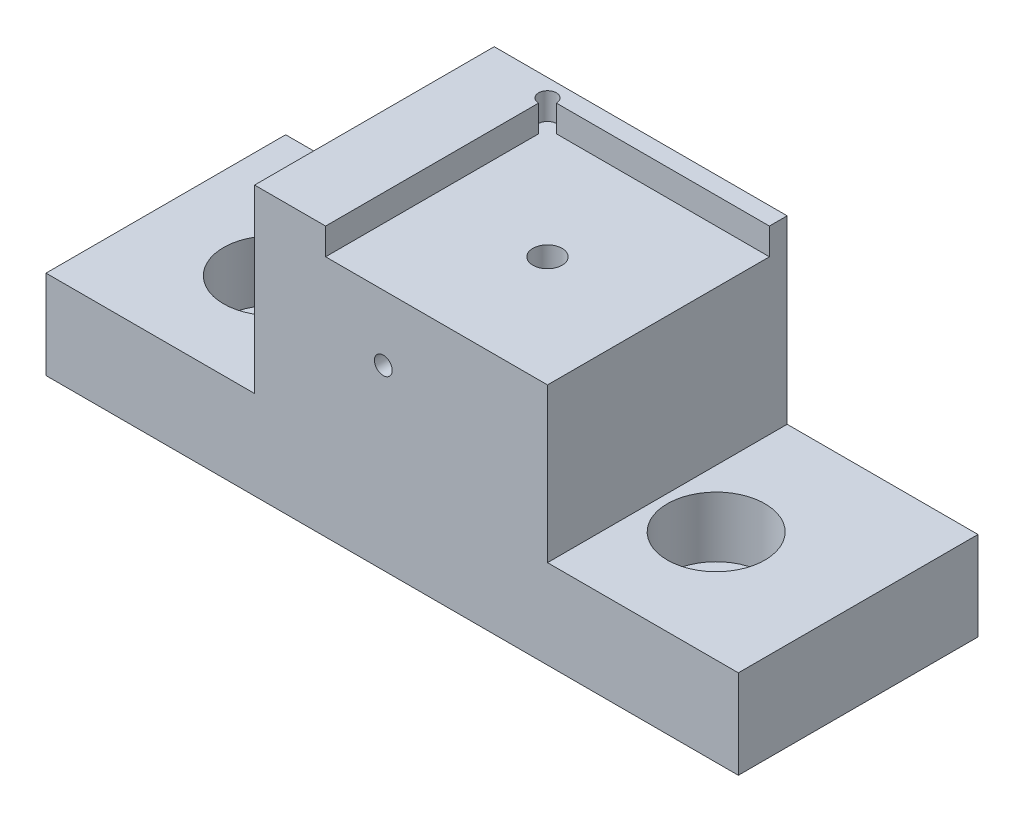
ISO-10303-21;
HEADER;
FILE_DESCRIPTION(('STEP AP214'),'2;1');
FILE_NAME('part.step','',(''),(''),'','','');
FILE_SCHEMA(('AUTOMOTIVE_DESIGN { 1 0 10303 214 1 1 1 1 }'));
ENDSEC;
DATA;
#1=APPLICATION_CONTEXT('core data for automotive mechanical design processes');
#2=APPLICATION_PROTOCOL_DEFINITION('international standard','automotive_design',2000,#1);
#3=PRODUCT_CONTEXT('',#1,'mechanical');
#4=PRODUCT('Part','Part','',(#3));
#5=PRODUCT_RELATED_PRODUCT_CATEGORY('part','',(#4));
#6=PRODUCT_DEFINITION_FORMATION('','',#4);
#7=PRODUCT_DEFINITION_CONTEXT('part definition',#1,'design');
#8=PRODUCT_DEFINITION('design','',#6,#7);
#9=PRODUCT_DEFINITION_SHAPE('','',#8);
#10=(LENGTH_UNIT() NAMED_UNIT(*) SI_UNIT(.MILLI.,.METRE.));
#11=(NAMED_UNIT(*) PLANE_ANGLE_UNIT() SI_UNIT($,.RADIAN.));
#12=(NAMED_UNIT(*) SI_UNIT($,.STERADIAN.) SOLID_ANGLE_UNIT());
#13=UNCERTAINTY_MEASURE_WITH_UNIT(LENGTH_MEASURE(1.E-05),#10,'distance_accuracy_value','');
#14=(GEOMETRIC_REPRESENTATION_CONTEXT(3) GLOBAL_UNCERTAINTY_ASSIGNED_CONTEXT((#13)) GLOBAL_UNIT_ASSIGNED_CONTEXT((#10,
#11,#12)) REPRESENTATION_CONTEXT('',''));
#15=CARTESIAN_POINT('',(0.,0.,0.));
#16=DIRECTION('',(0.,0.,1.));
#17=DIRECTION('',(1.,0.,0.));
#18=AXIS2_PLACEMENT_3D('',#15,#16,#17);
#19=CARTESIAN_POINT('',(-14.5,5.,-14.5));
#20=DIRECTION('',(0.,0.,1.));
#21=DIRECTION('',(1.,0.,0.));
#22=AXIS2_PLACEMENT_3D('',#19,#20,#21);
#23=PLANE('',#22);
#24=DIRECTION('',(0.,-1.,0.));
#25=VECTOR('',#24,1.);
#26=CARTESIAN_POINT('',(-44.,-15.3411677323979,-14.5));
#27=LINE('',#26,#25);
#28=CARTESIAN_POINT('',(-44.,-15.3411677323979,-14.5));
#29=VERTEX_POINT('',#28);
#30=CARTESIAN_POINT('',(-44.,-25.3411677323979,-14.5));
#31=VERTEX_POINT('',#30);
#32=EDGE_CURVE('E217',#29,#31,#27,.T.);
#33=ORIENTED_EDGE('',*,*,#32,.F.);
#34=DIRECTION('',(-1.,0.,0.));
#35=VECTOR('',#34,1.);
#36=CARTESIAN_POINT('',(34.,-15.3411677323979,-14.5));
#37=LINE('',#36,#35);
#38=CARTESIAN_POINT('',(-20.5,-15.3411677323979,-14.5));
#39=VERTEX_POINT('',#38);
#40=EDGE_CURVE('E224',#39,#29,#37,.T.);
#41=ORIENTED_EDGE('',*,*,#40,.F.);
#42=DIRECTION('',(0.,1.,0.));
#43=VECTOR('',#42,1.);
#44=CARTESIAN_POINT('',(-20.5,-70.794440441852,-14.5));
#45=LINE('',#44,#43);
#46=CARTESIAN_POINT('',(-20.5,5.,-14.5));
#47=VERTEX_POINT('',#46);
#48=EDGE_CURVE('E297',#39,#47,#45,.T.);
#49=ORIENTED_EDGE('',*,*,#48,.T.);
#50=DIRECTION('',(-1.,0.,0.));
#51=VECTOR('',#50,1.);
#52=CARTESIAN_POINT('',(-14.5,5.,-14.5));
#53=LINE('',#52,#51);
#54=CARTESIAN_POINT('',(12.5,5.,-14.5));
#55=VERTEX_POINT('',#54);
#56=EDGE_CURVE('E48',#55,#47,#53,.T.);
#57=ORIENTED_EDGE('',*,*,#56,.F.);
#58=DIRECTION('',(0.,1.,0.));
#59=VECTOR('',#58,1.);
#60=CARTESIAN_POINT('',(12.5,-25.3411677323979,-14.5));
#61=LINE('',#60,#59);
#62=CARTESIAN_POINT('',(12.5,-15.3411677323979,-14.5));
#63=VERTEX_POINT('',#62);
#64=EDGE_CURVE('E269',#63,#55,#61,.T.);
#65=ORIENTED_EDGE('',*,*,#64,.F.);
#66=CARTESIAN_POINT('',(34.,-15.3411677323979,-14.5));
#67=VERTEX_POINT('',#66);
#68=EDGE_CURVE('E229',#67,#63,#37,.T.);
#69=ORIENTED_EDGE('',*,*,#68,.F.);
#70=DIRECTION('',(0.,1.,0.));
#71=VECTOR('',#70,1.);
#72=CARTESIAN_POINT('',(34.,-15.3411677323979,-14.5));
#73=LINE('',#72,#71);
#74=CARTESIAN_POINT('',(34.,-25.3411677323979,-14.5));
#75=VERTEX_POINT('',#74);
#76=EDGE_CURVE('E225',#75,#67,#73,.T.);
#77=ORIENTED_EDGE('',*,*,#76,.F.);
#78=DIRECTION('',(1.,0.,0.));
#79=VECTOR('',#78,1.);
#80=CARTESIAN_POINT('',(14.5,-25.3411677323979,-14.5));
#81=LINE('',#80,#79);
#82=EDGE_CURVE('E298',#31,#75,#81,.T.);
#83=ORIENTED_EDGE('',*,*,#82,.F.);
#84=EDGE_LOOP('',(#33,#41,#49,#57,#65,#69,#77,#83));
#85=FACE_BOUND('',#84,.T.);
#86=ADVANCED_FACE('F40',(#85),#23,.F.);
#87=CARTESIAN_POINT('',(-6.0032,-25.3411677323979,-0.00319999999999834));
#88=DIRECTION('',(0.,-1.,0.));
#89=DIRECTION('',(0.,0.,-1.));
#90=AXIS2_PLACEMENT_3D('',#87,#88,#89);
#91=PLANE('',#90);
#92=CARTESIAN_POINT('',(-6.,-25.3411677323979,0.));
#93=DIRECTION('',(0.,-1.,0.));
#94=DIRECTION('',(0.,0.,-1.));
#95=AXIS2_PLACEMENT_3D('',#92,#93,#94);
#96=CIRCLE('',#95,2.5);
#97=CARTESIAN_POINT('',(-6.,-25.3411677323979,-2.5));
#98=VERTEX_POINT('',#97);
#99=EDGE_CURVE('E171',#98,#98,#96,.T.);
#100=ORIENTED_EDGE('',*,*,#99,.F.);
#101=EDGE_LOOP('',(#100));
#102=FACE_BOUND('',#101,.T.);
#103=CARTESIAN_POINT('',(3.5,-25.3411677323979,0.));
#104=DIRECTION('',(0.,-1.,0.));
#105=DIRECTION('',(0.,0.,-1.));
#106=AXIS2_PLACEMENT_3D('',#103,#104,#105);
#107=CIRCLE('',#106,2.);
#108=CARTESIAN_POINT('',(3.5,-25.3411677323979,2.));
#109=VERTEX_POINT('',#108);
#110=CARTESIAN_POINT('',(3.5,-25.3411677323979,-2.));
#111=VERTEX_POINT('',#110);
#112=EDGE_CURVE('E56',#109,#111,#107,.T.);
#113=ORIENTED_EDGE('',*,*,#112,.F.);
#114=DIRECTION('',(-1.,0.,0.));
#115=VECTOR('',#114,1.);
#116=CARTESIAN_POINT('',(3.5,-25.3411677323979,2.));
#117=LINE('',#116,#115);
#118=CARTESIAN_POINT('',(4.5,-25.3411677323979,2.));
#119=VERTEX_POINT('',#118);
#120=EDGE_CURVE('E185',#119,#109,#117,.T.);
#121=ORIENTED_EDGE('',*,*,#120,.F.);
#122=CARTESIAN_POINT('',(4.5,-25.3411677323979,0.));
#123=DIRECTION('',(0.,-1.,0.));
#124=DIRECTION('',(0.,0.,-1.));
#125=AXIS2_PLACEMENT_3D('',#122,#123,#124);
#126=CIRCLE('',#125,2.);
#127=CARTESIAN_POINT('',(4.5,-25.3411677323979,-2.));
#128=VERTEX_POINT('',#127);
#129=EDGE_CURVE('E199',#128,#119,#126,.T.);
#130=ORIENTED_EDGE('',*,*,#129,.F.);
#131=DIRECTION('',(1.,0.,0.));
#132=VECTOR('',#131,1.);
#133=CARTESIAN_POINT('',(3.5,-25.3411677323979,-2.));
#134=LINE('',#133,#132);
#135=EDGE_CURVE('E196',#111,#128,#134,.T.);
#136=ORIENTED_EDGE('',*,*,#135,.F.);
#137=EDGE_LOOP('',(#113,#121,#130,#136));
#138=FACE_BOUND('',#137,.T.);
#139=CARTESIAN_POINT('',(-16.,-25.3411677323979,0.));
#140=DIRECTION('',(0.,-1.,0.));
#141=DIRECTION('',(0.,0.,-1.));
#142=AXIS2_PLACEMENT_3D('',#139,#140,#141);
#143=CIRCLE('',#142,2.);
#144=CARTESIAN_POINT('',(-16.,-25.3411677323979,-2.));
#145=VERTEX_POINT('',#144);
#146=EDGE_CURVE('E206',#145,#145,#143,.T.);
#147=ORIENTED_EDGE('',*,*,#146,.F.);
#148=EDGE_LOOP('',(#147));
#149=FACE_BOUND('',#148,.T.);
#150=CARTESIAN_POINT('',(-31.,-25.3411677323979,0.));
#151=DIRECTION('',(0.,-1.,0.));
#152=DIRECTION('',(0.,0.,-1.));
#153=AXIS2_PLACEMENT_3D('',#150,#151,#152);
#154=CIRCLE('',#153,3.3);
#155=CARTESIAN_POINT('',(-31.,-25.3411677323979,-3.3));
#156=VERTEX_POINT('',#155);
#157=EDGE_CURVE('E43',#156,#156,#154,.T.);
#158=ORIENTED_EDGE('',*,*,#157,.F.);
#159=EDGE_LOOP('',(#158));
#160=FACE_BOUND('',#159,.T.);
#161=CARTESIAN_POINT('',(19.,-25.3411677323979,0.));
#162=DIRECTION('',(0.,-1.,0.));
#163=DIRECTION('',(0.,0.,-1.));
#164=AXIS2_PLACEMENT_3D('',#161,#162,#163);
#165=CIRCLE('',#164,3.3);
#166=CARTESIAN_POINT('',(19.,-25.3411677323979,-3.3));
#167=VERTEX_POINT('',#166);
#168=EDGE_CURVE('E249',#167,#167,#165,.T.);
#169=ORIENTED_EDGE('',*,*,#168,.F.);
#170=EDGE_LOOP('',(#169));
#171=FACE_BOUND('',#170,.T.);
#172=DIRECTION('',(-1.,0.,0.));
#173=VECTOR('',#172,1.);
#174=CARTESIAN_POINT('',(-20.5,-25.3411677323979,12.5));
#175=LINE('',#174,#173);
#176=CARTESIAN_POINT('',(34.,-25.3411677323979,12.5));
#177=VERTEX_POINT('',#176);
#178=CARTESIAN_POINT('',(-44.,-25.3411677323979,12.5));
#179=VERTEX_POINT('',#178);
#180=EDGE_CURVE('E266',#177,#179,#175,.T.);
#181=ORIENTED_EDGE('',*,*,#180,.T.);
#182=DIRECTION('',(0.,0.,1.));
#183=VECTOR('',#182,1.);
#184=CARTESIAN_POINT('',(-44.,-25.3411677323979,-14.5));
#185=LINE('',#184,#183);
#186=EDGE_CURVE('E219',#31,#179,#185,.T.);
#187=ORIENTED_EDGE('',*,*,#186,.F.);
#188=ORIENTED_EDGE('',*,*,#82,.T.);
#189=DIRECTION('',(0.,0.,1.));
#190=VECTOR('',#189,1.);
#191=CARTESIAN_POINT('',(34.,-25.3411677323979,12.5));
#192=LINE('',#191,#190);
#193=EDGE_CURVE('E254',#75,#177,#192,.T.);
#194=ORIENTED_EDGE('',*,*,#193,.T.);
#195=EDGE_LOOP('',(#181,#187,#188,#194));
#196=FACE_BOUND('',#195,.T.);
#197=ADVANCED_FACE('F330',(#102,#138,#149,#160,#171,#196),#91,.T.);
#198=CARTESIAN_POINT('',(-20.5,-25.3411677323979,12.5));
#199=DIRECTION('',(0.,0.,-1.));
#200=DIRECTION('',(-1.,0.,0.));
#201=AXIS2_PLACEMENT_3D('',#198,#199,#200);
#202=PLANE('',#201);
#203=CARTESIAN_POINT('',(-6.,-5.34116773239792,12.5));
#204=DIRECTION('',(0.,0.,1.));
#205=DIRECTION('',(1.,0.,0.));
#206=AXIS2_PLACEMENT_3D('',#203,#204,#205);
#207=CIRCLE('',#206,1.0000000000003);
#208=CARTESIAN_POINT('',(-4.9999999999997,-5.34116773239792,12.5));
#209=VERTEX_POINT('',#208);
#210=EDGE_CURVE('E170',#209,#209,#207,.T.);
#211=ORIENTED_EDGE('',*,*,#210,.F.);
#212=EDGE_LOOP('',(#211));
#213=FACE_BOUND('',#212,.T.);
#214=DIRECTION('',(0.,1.,0.));
#215=VECTOR('',#214,1.);
#216=CARTESIAN_POINT('',(-44.,-25.3411677323979,12.5));
#217=LINE('',#216,#215);
#218=CARTESIAN_POINT('',(-44.,-15.3411677323979,12.5));
#219=VERTEX_POINT('',#218);
#220=EDGE_CURVE('E64',#179,#219,#217,.T.);
#221=ORIENTED_EDGE('',*,*,#220,.F.);
#222=ORIENTED_EDGE('',*,*,#180,.F.);
#223=DIRECTION('',(0.,-1.,0.));
#224=VECTOR('',#223,1.);
#225=CARTESIAN_POINT('',(34.,-15.3411677323979,12.5));
#226=LINE('',#225,#224);
#227=CARTESIAN_POINT('',(34.,-15.3411677323979,12.5));
#228=VERTEX_POINT('',#227);
#229=EDGE_CURVE('E258',#228,#177,#226,.T.);
#230=ORIENTED_EDGE('',*,*,#229,.F.);
#231=DIRECTION('',(-1.,0.,0.));
#232=VECTOR('',#231,1.);
#233=CARTESIAN_POINT('',(-46.,-15.3411677323979,12.5));
#234=LINE('',#233,#232);
#235=CARTESIAN_POINT('',(12.5,-15.3411677323979,12.5));
#236=VERTEX_POINT('',#235);
#237=EDGE_CURVE('E255',#228,#236,#234,.T.);
#238=ORIENTED_EDGE('',*,*,#237,.T.);
#239=DIRECTION('',(0.,1.,0.));
#240=VECTOR('',#239,1.);
#241=CARTESIAN_POINT('',(12.5,-25.3411677323979,12.5));
#242=LINE('',#241,#240);
#243=CARTESIAN_POINT('',(12.5,2.,12.5));
#244=VERTEX_POINT('',#243);
#245=EDGE_CURVE('E277',#236,#244,#242,.T.);
#246=ORIENTED_EDGE('',*,*,#245,.T.);
#247=DIRECTION('',(-1.,0.,0.));
#248=VECTOR('',#247,1.);
#249=CARTESIAN_POINT('',(-12.5,2.,12.5));
#250=LINE('',#249,#248);
#251=CARTESIAN_POINT('',(-12.5,2.,12.5));
#252=VERTEX_POINT('',#251);
#253=EDGE_CURVE('E305',#244,#252,#250,.T.);
#254=ORIENTED_EDGE('',*,*,#253,.T.);
#255=DIRECTION('',(0.,1.,0.));
#256=VECTOR('',#255,1.);
#257=CARTESIAN_POINT('',(-12.5,2.,12.5));
#258=LINE('',#257,#256);
#259=CARTESIAN_POINT('',(-12.5,5.,12.5));
#260=VERTEX_POINT('',#259);
#261=EDGE_CURVE('E321',#252,#260,#258,.T.);
#262=ORIENTED_EDGE('',*,*,#261,.T.);
#263=DIRECTION('',(-1.,0.,0.));
#264=VECTOR('',#263,1.);
#265=CARTESIAN_POINT('',(-20.5,5.,12.5));
#266=LINE('',#265,#264);
#267=CARTESIAN_POINT('',(-20.5,5.,12.5));
#268=VERTEX_POINT('',#267);
#269=EDGE_CURVE('E270',#260,#268,#266,.T.);
#270=ORIENTED_EDGE('',*,*,#269,.T.);
#271=DIRECTION('',(0.,1.,0.));
#272=VECTOR('',#271,1.);
#273=CARTESIAN_POINT('',(-20.5,-25.3411677323979,12.5));
#274=LINE('',#273,#272);
#275=CARTESIAN_POINT('',(-20.5,-15.3411677323979,12.5));
#276=VERTEX_POINT('',#275);
#277=EDGE_CURVE('E274',#276,#268,#274,.T.);
#278=ORIENTED_EDGE('',*,*,#277,.F.);
#279=EDGE_CURVE('E253',#276,#219,#234,.T.);
#280=ORIENTED_EDGE('',*,*,#279,.T.);
#281=EDGE_LOOP('',(#221,#222,#230,#238,#246,#254,#262,#270,#278,#280));
#282=FACE_BOUND('',#281,.T.);
#283=ADVANCED_FACE('F333',(#213,#282),#202,.F.);
#284=CARTESIAN_POINT('',(0.,-15.3411677323979,0.));
#285=DIRECTION('',(0.,-1.,0.));
#286=DIRECTION('',(0.,0.,-1.));
#287=AXIS2_PLACEMENT_3D('',#284,#285,#286);
#288=PLANE('',#287);
#289=CARTESIAN_POINT('',(-31.,-15.3411677323979,0.));
#290=DIRECTION('',(0.,1.,0.));
#291=DIRECTION('',(0.,0.,1.));
#292=AXIS2_PLACEMENT_3D('',#289,#290,#291);
#293=CIRCLE('',#292,5.5);
#294=CARTESIAN_POINT('',(-31.,-15.3411677323979,5.5));
#295=VERTEX_POINT('',#294);
#296=EDGE_CURVE('E228',#295,#295,#293,.T.);
#297=ORIENTED_EDGE('',*,*,#296,.F.);
#298=EDGE_LOOP('',(#297));
#299=FACE_BOUND('',#298,.T.);
#300=DIRECTION('',(0.,0.,-1.));
#301=VECTOR('',#300,1.);
#302=CARTESIAN_POINT('',(-44.,-15.3411677323979,12.5));
#303=LINE('',#302,#301);
#304=EDGE_CURVE('E222',#219,#29,#303,.T.);
#305=ORIENTED_EDGE('',*,*,#304,.F.);
#306=ORIENTED_EDGE('',*,*,#279,.F.);
#307=DIRECTION('',(0.,0.,-1.));
#308=VECTOR('',#307,1.);
#309=CARTESIAN_POINT('',(-20.5,-15.3411677323979,14.5));
#310=LINE('',#309,#308);
#311=EDGE_CURVE('E263',#276,#39,#310,.T.);
#312=ORIENTED_EDGE('',*,*,#311,.T.);
#313=ORIENTED_EDGE('',*,*,#40,.T.);
#314=EDGE_LOOP('',(#305,#306,#312,#313));
#315=FACE_BOUND('',#314,.T.);
#316=ADVANCED_FACE('F384',(#299,#315),#288,.F.);
#317=CARTESIAN_POINT('',(-20.5,-70.794440441852,14.5));
#318=DIRECTION('',(1.,0.,0.));
#319=DIRECTION('',(0.,0.,-1.));
#320=AXIS2_PLACEMENT_3D('',#317,#318,#319);
#321=PLANE('',#320);
#322=ORIENTED_EDGE('',*,*,#48,.F.);
#323=ORIENTED_EDGE('',*,*,#311,.F.);
#324=ORIENTED_EDGE('',*,*,#277,.T.);
#325=DIRECTION('',(0.,0.,1.));
#326=VECTOR('',#325,1.);
#327=CARTESIAN_POINT('',(-20.5,5.,14.5));
#328=LINE('',#327,#326);
#329=EDGE_CURVE('E276',#47,#268,#328,.T.);
#330=ORIENTED_EDGE('',*,*,#329,.F.);
#331=EDGE_LOOP('',(#322,#323,#324,#330));
#332=FACE_BOUND('',#331,.T.);
#333=ADVANCED_FACE('F380',(#332),#321,.F.);
#334=CARTESIAN_POINT('',(12.5,-25.3411677323979,12.5));
#335=DIRECTION('',(-1.,0.,0.));
#336=DIRECTION('',(0.,0.,1.));
#337=AXIS2_PLACEMENT_3D('',#334,#335,#336);
#338=PLANE('',#337);
#339=DIRECTION('',(0.,0.,1.));
#340=VECTOR('',#339,1.);
#341=CARTESIAN_POINT('',(12.5,-15.3411677323979,12.5));
#342=LINE('',#341,#340);
#343=EDGE_CURVE('E11',#63,#236,#342,.T.);
#344=ORIENTED_EDGE('',*,*,#343,.F.);
#345=ORIENTED_EDGE('',*,*,#64,.T.);
#346=DIRECTION('',(0.,0.,1.));
#347=VECTOR('',#346,1.);
#348=CARTESIAN_POINT('',(12.5,5.,12.5));
#349=LINE('',#348,#347);
#350=CARTESIAN_POINT('',(12.5,5.,-12.5));
#351=VERTEX_POINT('',#350);
#352=EDGE_CURVE('E265',#55,#351,#349,.T.);
#353=ORIENTED_EDGE('',*,*,#352,.T.);
#354=DIRECTION('',(0.,1.,0.));
#355=VECTOR('',#354,1.);
#356=CARTESIAN_POINT('',(12.5,2.,-12.5));
#357=LINE('',#356,#355);
#358=CARTESIAN_POINT('',(12.5,2.,-12.5));
#359=VERTEX_POINT('',#358);
#360=EDGE_CURVE('E314',#359,#351,#357,.T.);
#361=ORIENTED_EDGE('',*,*,#360,.F.);
#362=DIRECTION('',(0.,0.,1.));
#363=VECTOR('',#362,1.);
#364=CARTESIAN_POINT('',(12.5,2.,12.5));
#365=LINE('',#364,#363);
#366=EDGE_CURVE('E302',#359,#244,#365,.T.);
#367=ORIENTED_EDGE('',*,*,#366,.T.);
#368=ORIENTED_EDGE('',*,*,#245,.F.);
#369=EDGE_LOOP('',(#344,#345,#353,#361,#367,#368));
#370=FACE_BOUND('',#369,.T.);
#371=ADVANCED_FACE('F354',(#370),#338,.F.);
#372=CARTESIAN_POINT('',(0.,5.,0.));
#373=DIRECTION('',(0.,1.,0.));
#374=DIRECTION('',(0.,0.,1.));
#375=AXIS2_PLACEMENT_3D('',#372,#373,#374);
#376=PLANE('',#375);
#377=ORIENTED_EDGE('',*,*,#269,.F.);
#378=DIRECTION('',(0.,0.,-1.));
#379=VECTOR('',#378,1.);
#380=CARTESIAN_POINT('',(-12.5,5.,12.5));
#381=LINE('',#380,#379);
#382=CARTESIAN_POINT('',(-12.5,5.,-11.5));
#383=VERTEX_POINT('',#382);
#384=EDGE_CURVE('E300',#260,#383,#381,.T.);
#385=ORIENTED_EDGE('',*,*,#384,.T.);
#386=CARTESIAN_POINT('',(-12.5,5.,-12.5));
#387=DIRECTION('',(0.,1.,0.));
#388=DIRECTION('',(0.,0.,1.));
#389=AXIS2_PLACEMENT_3D('',#386,#387,#388);
#390=CIRCLE('',#389,1.);
#391=CARTESIAN_POINT('',(-11.5,5.,-12.5));
#392=VERTEX_POINT('',#391);
#393=EDGE_CURVE('E282',#392,#383,#390,.T.);
#394=ORIENTED_EDGE('',*,*,#393,.F.);
#395=DIRECTION('',(1.,0.,0.));
#396=VECTOR('',#395,1.);
#397=CARTESIAN_POINT('',(-12.5,5.,-12.5));
#398=LINE('',#397,#396);
#399=EDGE_CURVE('E306',#392,#351,#398,.T.);
#400=ORIENTED_EDGE('',*,*,#399,.T.);
#401=ORIENTED_EDGE('',*,*,#352,.F.);
#402=ORIENTED_EDGE('',*,*,#56,.T.);
#403=ORIENTED_EDGE('',*,*,#329,.T.);
#404=EDGE_LOOP('',(#377,#385,#394,#400,#401,#402,#403));
#405=FACE_BOUND('',#404,.T.);
#406=ADVANCED_FACE('F358',(#405),#376,.T.);
#407=CARTESIAN_POINT('',(-12.5,2.,12.5));
#408=DIRECTION('',(1.,0.,0.));
#409=DIRECTION('',(0.,0.,-1.));
#410=AXIS2_PLACEMENT_3D('',#407,#408,#409);
#411=PLANE('',#410);
#412=DIRECTION('',(0.,1.,0.));
#413=VECTOR('',#412,1.);
#414=CARTESIAN_POINT('',(-12.5,-0.828427124746196,-11.5));
#415=LINE('',#414,#413);
#416=CARTESIAN_POINT('',(-12.5,2.,-11.5));
#417=VERTEX_POINT('',#416);
#418=EDGE_CURVE('E289',#383,#417,#415,.F.);
#419=ORIENTED_EDGE('',*,*,#418,.F.);
#420=ORIENTED_EDGE('',*,*,#384,.F.);
#421=ORIENTED_EDGE('',*,*,#261,.F.);
#422=DIRECTION('',(0.,0.,-1.));
#423=VECTOR('',#422,1.);
#424=CARTESIAN_POINT('',(-12.5,2.,12.5));
#425=LINE('',#424,#423);
#426=EDGE_CURVE('E308',#252,#417,#425,.T.);
#427=ORIENTED_EDGE('',*,*,#426,.T.);
#428=EDGE_LOOP('',(#419,#420,#421,#427));
#429=FACE_BOUND('',#428,.T.);
#430=ADVANCED_FACE('F375',(#429),#411,.T.);
#431=CARTESIAN_POINT('',(-12.5,2.,-12.5));
#432=DIRECTION('',(0.,0.,1.));
#433=DIRECTION('',(1.,0.,0.));
#434=AXIS2_PLACEMENT_3D('',#431,#432,#433);
#435=PLANE('',#434);
#436=DIRECTION('',(0.,1.,0.));
#437=VECTOR('',#436,1.);
#438=CARTESIAN_POINT('',(-11.5,-0.828427124746196,-12.5));
#439=LINE('',#438,#437);
#440=CARTESIAN_POINT('',(-11.5,2.,-12.5));
#441=VERTEX_POINT('',#440);
#442=EDGE_CURVE('E287',#441,#392,#439,.T.);
#443=ORIENTED_EDGE('',*,*,#442,.F.);
#444=DIRECTION('',(1.,0.,0.));
#445=VECTOR('',#444,1.);
#446=CARTESIAN_POINT('',(-12.5,2.,-12.5));
#447=LINE('',#446,#445);
#448=EDGE_CURVE('E311',#441,#359,#447,.T.);
#449=ORIENTED_EDGE('',*,*,#448,.T.);
#450=ORIENTED_EDGE('',*,*,#360,.T.);
#451=ORIENTED_EDGE('',*,*,#399,.F.);
#452=EDGE_LOOP('',(#443,#449,#450,#451));
#453=FACE_BOUND('',#452,.T.);
#454=ADVANCED_FACE('F364',(#453),#435,.T.);
#455=CARTESIAN_POINT('',(0.,2.,0.));
#456=DIRECTION('',(0.,-1.,0.));
#457=DIRECTION('',(0.,0.,-1.));
#458=AXIS2_PLACEMENT_3D('',#455,#456,#457);
#459=PLANE('',#458);
#460=CARTESIAN_POINT('',(0.,2.,0.));
#461=DIRECTION('',(0.,1.,0.));
#462=DIRECTION('',(0.,0.,1.));
#463=AXIS2_PLACEMENT_3D('',#460,#461,#462);
#464=CIRCLE('',#463,1.64999999999999);
#465=CARTESIAN_POINT('',(0.,2.,1.64999999999999));
#466=VERTEX_POINT('',#465);
#467=EDGE_CURVE('E291',#466,#466,#464,.T.);
#468=ORIENTED_EDGE('',*,*,#467,.F.);
#469=EDGE_LOOP('',(#468));
#470=FACE_BOUND('',#469,.T.);
#471=ORIENTED_EDGE('',*,*,#448,.F.);
#472=CARTESIAN_POINT('',(-12.5,2.,-12.5));
#473=DIRECTION('',(0.,-1.,0.));
#474=DIRECTION('',(0.,0.,-1.));
#475=AXIS2_PLACEMENT_3D('',#472,#473,#474);
#476=CIRCLE('',#475,1.);
#477=EDGE_CURVE('E284',#441,#417,#476,.F.);
#478=ORIENTED_EDGE('',*,*,#477,.T.);
#479=ORIENTED_EDGE('',*,*,#426,.F.);
#480=ORIENTED_EDGE('',*,*,#253,.F.);
#481=ORIENTED_EDGE('',*,*,#366,.F.);
#482=EDGE_LOOP('',(#471,#478,#479,#480,#481));
#483=FACE_BOUND('',#482,.T.);
#484=ADVANCED_FACE('F370',(#470,#483),#459,.F.);
#485=CARTESIAN_POINT('',(0.,-8.1,0.));
#486=DIRECTION('',(0.,1.,0.));
#487=DIRECTION('',(0.,0.,1.));
#488=AXIS2_PLACEMENT_3D('',#485,#486,#487);
#489=CONICAL_SURFACE('',#488,1.64999999999999,1.02974425867665);
#490=CARTESIAN_POINT('',(0.,-9.09142002139548,0.));
#491=VERTEX_POINT('',#490);
#492=VERTEX_LOOP('',#491);
#493=FACE_BOUND('',#492,.T.);
#494=CARTESIAN_POINT('',(0.,-8.1,0.));
#495=DIRECTION('',(0.,1.,0.));
#496=DIRECTION('',(0.,0.,1.));
#497=AXIS2_PLACEMENT_3D('',#494,#495,#496);
#498=CIRCLE('',#497,1.64999999999999);
#499=CARTESIAN_POINT('',(0.,-8.1,1.64999999999999));
#500=VERTEX_POINT('',#499);
#501=EDGE_CURVE('E294',#500,#500,#498,.T.);
#502=ORIENTED_EDGE('',*,*,#501,.T.);
#503=EDGE_LOOP('',(#502));
#504=FACE_BOUND('',#503,.T.);
#505=ADVANCED_FACE('F464',(#493,#504),#489,.F.);
#506=CARTESIAN_POINT('',(0.,2.,0.));
#507=DIRECTION('',(0.,1.,0.));
#508=DIRECTION('',(0.,0.,1.));
#509=AXIS2_PLACEMENT_3D('',#506,#507,#508);
#510=CYLINDRICAL_SURFACE('',#509,1.64999999999999);
#511=ORIENTED_EDGE('',*,*,#501,.F.);
#512=EDGE_LOOP('',(#511));
#513=FACE_BOUND('',#512,.T.);
#514=ORIENTED_EDGE('',*,*,#467,.T.);
#515=EDGE_LOOP('',(#514));
#516=FACE_BOUND('',#515,.T.);
#517=ADVANCED_FACE('F473',(#513,#516),#510,.F.);
#518=CARTESIAN_POINT('',(-12.5,-0.828427124746196,-12.5));
#519=DIRECTION('',(0.,1.,0.));
#520=DIRECTION('',(0.,0.,1.));
#521=AXIS2_PLACEMENT_3D('',#518,#519,#520);
#522=CYLINDRICAL_SURFACE('',#521,1.);
#523=ORIENTED_EDGE('',*,*,#418,.T.);
#524=ORIENTED_EDGE('',*,*,#477,.F.);
#525=ORIENTED_EDGE('',*,*,#442,.T.);
#526=ORIENTED_EDGE('',*,*,#393,.T.);
#527=EDGE_LOOP('',(#523,#524,#525,#526));
#528=FACE_BOUND('',#527,.T.);
#529=ADVANCED_FACE('F482',(#528),#522,.F.);
#530=CARTESIAN_POINT('',(34.,-15.3411677323979,12.5));
#531=DIRECTION('',(1.,0.,0.));
#532=DIRECTION('',(0.,0.,-1.));
#533=AXIS2_PLACEMENT_3D('',#530,#531,#532);
#534=PLANE('',#533);
#535=ORIENTED_EDGE('',*,*,#193,.F.);
#536=ORIENTED_EDGE('',*,*,#76,.T.);
#537=DIRECTION('',(0.,0.,1.));
#538=VECTOR('',#537,1.);
#539=CARTESIAN_POINT('',(34.,-15.3411677323979,12.5));
#540=LINE('',#539,#538);
#541=EDGE_CURVE('E250',#67,#228,#540,.T.);
#542=ORIENTED_EDGE('',*,*,#541,.T.);
#543=ORIENTED_EDGE('',*,*,#229,.T.);
#544=EDGE_LOOP('',(#535,#536,#542,#543));
#545=FACE_BOUND('',#544,.T.);
#546=ADVANCED_FACE('F343',(#545),#534,.T.);
#547=CARTESIAN_POINT('',(19.,-15.3411677323979,0.));
#548=DIRECTION('',(0.,1.,0.));
#549=DIRECTION('',(0.,0.,1.));
#550=AXIS2_PLACEMENT_3D('',#547,#548,#549);
#551=CIRCLE('',#550,5.5);
#552=CARTESIAN_POINT('',(19.,-15.3411677323979,5.5));
#553=VERTEX_POINT('',#552);
#554=EDGE_CURVE('E240',#553,#553,#551,.T.);
#555=ORIENTED_EDGE('',*,*,#554,.F.);
#556=EDGE_LOOP('',(#555));
#557=FACE_BOUND('',#556,.T.);
#558=ORIENTED_EDGE('',*,*,#541,.F.);
#559=ORIENTED_EDGE('',*,*,#68,.T.);
#560=ORIENTED_EDGE('',*,*,#343,.T.);
#561=ORIENTED_EDGE('',*,*,#237,.F.);
#562=EDGE_LOOP('',(#558,#559,#560,#561));
#563=FACE_BOUND('',#562,.T.);
#564=ADVANCED_FACE('F347',(#557,#563),#288,.F.);
#565=CARTESIAN_POINT('',(19.,-15.3411677323979,0.));
#566=DIRECTION('',(0.,1.,0.));
#567=DIRECTION('',(0.,0.,1.));
#568=AXIS2_PLACEMENT_3D('',#565,#566,#567);
#569=CYLINDRICAL_SURFACE('',#568,3.3);
#570=ORIENTED_EDGE('',*,*,#168,.T.);
#571=EDGE_LOOP('',(#570));
#572=FACE_BOUND('',#571,.T.);
#573=CARTESIAN_POINT('',(19.,-22.1411677323979,0.));
#574=DIRECTION('',(0.,1.,0.));
#575=DIRECTION('',(0.,0.,1.));
#576=AXIS2_PLACEMENT_3D('',#573,#574,#575);
#577=CIRCLE('',#576,3.3);
#578=CARTESIAN_POINT('',(19.,-22.1411677323979,3.3));
#579=VERTEX_POINT('',#578);
#580=EDGE_CURVE('E246',#579,#579,#577,.T.);
#581=ORIENTED_EDGE('',*,*,#580,.T.);
#582=EDGE_LOOP('',(#581));
#583=FACE_BOUND('',#582,.T.);
#584=ADVANCED_FACE('F327',(#572,#583),#569,.F.);
#585=CARTESIAN_POINT('',(22.3,-22.1411677323979,0.));
#586=DIRECTION('',(0.,-1.,0.));
#587=DIRECTION('',(0.,0.,-1.));
#588=AXIS2_PLACEMENT_3D('',#585,#586,#587);
#589=PLANE('',#588);
#590=ORIENTED_EDGE('',*,*,#580,.F.);
#591=EDGE_LOOP('',(#590));
#592=FACE_BOUND('',#591,.T.);
#593=CARTESIAN_POINT('',(19.,-22.1411677323979,0.));
#594=DIRECTION('',(0.,1.,0.));
#595=DIRECTION('',(0.,0.,1.));
#596=AXIS2_PLACEMENT_3D('',#593,#594,#595);
#597=CIRCLE('',#596,5.5);
#598=CARTESIAN_POINT('',(19.,-22.1411677323979,5.5));
#599=VERTEX_POINT('',#598);
#600=EDGE_CURVE('E243',#599,#599,#597,.T.);
#601=ORIENTED_EDGE('',*,*,#600,.T.);
#602=EDGE_LOOP('',(#601));
#603=FACE_BOUND('',#602,.T.);
#604=ADVANCED_FACE('F506',(#592,#603),#589,.F.);
#605=CARTESIAN_POINT('',(19.,-15.3411677323979,0.));
#606=DIRECTION('',(0.,1.,0.));
#607=DIRECTION('',(0.,0.,1.));
#608=AXIS2_PLACEMENT_3D('',#605,#606,#607);
#609=CYLINDRICAL_SURFACE('',#608,5.5);
#610=ORIENTED_EDGE('',*,*,#600,.F.);
#611=EDGE_LOOP('',(#610));
#612=FACE_BOUND('',#611,.T.);
#613=ORIENTED_EDGE('',*,*,#554,.T.);
#614=EDGE_LOOP('',(#613));
#615=FACE_BOUND('',#614,.T.);
#616=ADVANCED_FACE('F513',(#612,#615),#609,.F.);
#617=CARTESIAN_POINT('',(-31.,-15.3411677323979,0.));
#618=DIRECTION('',(0.,1.,0.));
#619=DIRECTION('',(0.,0.,1.));
#620=AXIS2_PLACEMENT_3D('',#617,#618,#619);
#621=CYLINDRICAL_SURFACE('',#620,3.3);
#622=ORIENTED_EDGE('',*,*,#157,.T.);
#623=EDGE_LOOP('',(#622));
#624=FACE_BOUND('',#623,.T.);
#625=CARTESIAN_POINT('',(-31.,-22.1411677323979,0.));
#626=DIRECTION('',(0.,1.,0.));
#627=DIRECTION('',(0.,0.,1.));
#628=AXIS2_PLACEMENT_3D('',#625,#626,#627);
#629=CIRCLE('',#628,3.3);
#630=CARTESIAN_POINT('',(-31.,-22.1411677323979,3.3));
#631=VERTEX_POINT('',#630);
#632=EDGE_CURVE('E237',#631,#631,#629,.T.);
#633=ORIENTED_EDGE('',*,*,#632,.T.);
#634=EDGE_LOOP('',(#633));
#635=FACE_BOUND('',#634,.T.);
#636=ADVANCED_FACE('F521',(#624,#635),#621,.F.);
#637=CARTESIAN_POINT('',(-27.7,-22.1411677323979,0.));
#638=DIRECTION('',(0.,-1.,0.));
#639=DIRECTION('',(0.,0.,-1.));
#640=AXIS2_PLACEMENT_3D('',#637,#638,#639);
#641=PLANE('',#640);
#642=ORIENTED_EDGE('',*,*,#632,.F.);
#643=EDGE_LOOP('',(#642));
#644=FACE_BOUND('',#643,.T.);
#645=CARTESIAN_POINT('',(-31.,-22.1411677323979,0.));
#646=DIRECTION('',(0.,1.,0.));
#647=DIRECTION('',(0.,0.,1.));
#648=AXIS2_PLACEMENT_3D('',#645,#646,#647);
#649=CIRCLE('',#648,5.5);
#650=CARTESIAN_POINT('',(-31.,-22.1411677323979,5.5));
#651=VERTEX_POINT('',#650);
#652=EDGE_CURVE('E234',#651,#651,#649,.T.);
#653=ORIENTED_EDGE('',*,*,#652,.T.);
#654=EDGE_LOOP('',(#653));
#655=FACE_BOUND('',#654,.T.);
#656=ADVANCED_FACE('F397',(#644,#655),#641,.F.);
#657=CARTESIAN_POINT('',(-31.,-15.3411677323979,0.));
#658=DIRECTION('',(0.,1.,0.));
#659=DIRECTION('',(0.,0.,1.));
#660=AXIS2_PLACEMENT_3D('',#657,#658,#659);
#661=CYLINDRICAL_SURFACE('',#660,5.5);
#662=ORIENTED_EDGE('',*,*,#652,.F.);
#663=EDGE_LOOP('',(#662));
#664=FACE_BOUND('',#663,.T.);
#665=ORIENTED_EDGE('',*,*,#296,.T.);
#666=EDGE_LOOP('',(#665));
#667=FACE_BOUND('',#666,.T.);
#668=ADVANCED_FACE('F388',(#664,#667),#661,.F.);
#669=CARTESIAN_POINT('',(-44.,0.,0.));
#670=DIRECTION('',(-1.,0.,0.));
#671=DIRECTION('',(0.,0.,1.));
#672=AXIS2_PLACEMENT_3D('',#669,#670,#671);
#673=PLANE('',#672);
#674=ORIENTED_EDGE('',*,*,#32,.T.);
#675=ORIENTED_EDGE('',*,*,#186,.T.);
#676=ORIENTED_EDGE('',*,*,#220,.T.);
#677=ORIENTED_EDGE('',*,*,#304,.T.);
#678=EDGE_LOOP('',(#674,#675,#676,#677));
#679=FACE_BOUND('',#678,.T.);
#680=ADVANCED_FACE('F385',(#679),#673,.T.);
#681=CARTESIAN_POINT('',(-16.,-20.3411677323979,0.));
#682=DIRECTION('',(0.,-1.,0.));
#683=DIRECTION('',(0.,0.,-1.));
#684=AXIS2_PLACEMENT_3D('',#681,#682,#683);
#685=CONICAL_SURFACE('',#684,2.,1.02974425867665);
#686=CARTESIAN_POINT('',(-16.,-19.1394464943428,0.));
#687=VERTEX_POINT('',#686);
#688=VERTEX_LOOP('',#687);
#689=FACE_BOUND('',#688,.T.);
#690=CARTESIAN_POINT('',(-16.,-20.3411677323979,0.));
#691=DIRECTION('',(0.,-1.,0.));
#692=DIRECTION('',(0.,0.,-1.));
#693=AXIS2_PLACEMENT_3D('',#690,#691,#692);
#694=CIRCLE('',#693,2.);
#695=CARTESIAN_POINT('',(-16.,-20.3411677323979,-2.));
#696=VERTEX_POINT('',#695);
#697=EDGE_CURVE('E214',#696,#696,#694,.T.);
#698=ORIENTED_EDGE('',*,*,#697,.T.);
#699=EDGE_LOOP('',(#698));
#700=FACE_BOUND('',#699,.T.);
#701=ADVANCED_FACE('F387',(#689,#700),#685,.F.);
#702=CARTESIAN_POINT('',(-16.,-25.3411677323979,0.));
#703=DIRECTION('',(0.,-1.,0.));
#704=DIRECTION('',(0.,0.,-1.));
#705=AXIS2_PLACEMENT_3D('',#702,#703,#704);
#706=CYLINDRICAL_SURFACE('',#705,2.);
#707=ORIENTED_EDGE('',*,*,#697,.F.);
#708=EDGE_LOOP('',(#707));
#709=FACE_BOUND('',#708,.T.);
#710=ORIENTED_EDGE('',*,*,#146,.T.);
#711=EDGE_LOOP('',(#710));
#712=FACE_BOUND('',#711,.T.);
#713=ADVANCED_FACE('F394',(#709,#712),#706,.F.);
#714=CARTESIAN_POINT('',(3.5,-20.3411677323979,0.));
#715=DIRECTION('',(0.,-1.,0.));
#716=DIRECTION('',(0.,0.,-1.));
#717=AXIS2_PLACEMENT_3D('',#714,#715,#716);
#718=CYLINDRICAL_SURFACE('',#717,2.);
#719=ORIENTED_EDGE('',*,*,#112,.T.);
#720=DIRECTION('',(0.,-1.,0.));
#721=VECTOR('',#720,1.);
#722=CARTESIAN_POINT('',(3.5,-20.3411677323979,-2.));
#723=LINE('',#722,#721);
#724=CARTESIAN_POINT('',(3.5,-20.3411677323979,-2.));
#725=VERTEX_POINT('',#724);
#726=EDGE_CURVE('E194',#725,#111,#723,.T.);
#727=ORIENTED_EDGE('',*,*,#726,.F.);
#728=CARTESIAN_POINT('',(3.5,-20.3411677323979,0.));
#729=DIRECTION('',(0.,-1.,0.));
#730=DIRECTION('',(0.,0.,-1.));
#731=AXIS2_PLACEMENT_3D('',#728,#729,#730);
#732=CIRCLE('',#731,2.);
#733=CARTESIAN_POINT('',(3.5,-20.3411677323979,2.));
#734=VERTEX_POINT('',#733);
#735=EDGE_CURVE('E181',#734,#725,#732,.T.);
#736=ORIENTED_EDGE('',*,*,#735,.F.);
#737=DIRECTION('',(0.,-1.,0.));
#738=VECTOR('',#737,1.);
#739=CARTESIAN_POINT('',(3.5,-20.3411677323979,2.));
#740=LINE('',#739,#738);
#741=EDGE_CURVE('E204',#734,#109,#740,.T.);
#742=ORIENTED_EDGE('',*,*,#741,.T.);
#743=EDGE_LOOP('',(#719,#727,#736,#742));
#744=FACE_BOUND('',#743,.T.);
#745=ADVANCED_FACE('F611',(#744),#718,.F.);
#746=CARTESIAN_POINT('',(3.5,-20.3411677323979,2.));
#747=DIRECTION('',(0.,0.,1.));
#748=DIRECTION('',(1.,0.,0.));
#749=AXIS2_PLACEMENT_3D('',#746,#747,#748);
#750=PLANE('',#749);
#751=ORIENTED_EDGE('',*,*,#120,.T.);
#752=ORIENTED_EDGE('',*,*,#741,.F.);
#753=DIRECTION('',(-1.,0.,0.));
#754=VECTOR('',#753,1.);
#755=CARTESIAN_POINT('',(3.5,-20.3411677323979,2.));
#756=LINE('',#755,#754);
#757=CARTESIAN_POINT('',(4.5,-20.3411677323979,2.));
#758=VERTEX_POINT('',#757);
#759=EDGE_CURVE('E191',#758,#734,#756,.T.);
#760=ORIENTED_EDGE('',*,*,#759,.F.);
#761=DIRECTION('',(0.,-1.,0.));
#762=VECTOR('',#761,1.);
#763=CARTESIAN_POINT('',(4.5,-20.3411677323979,2.));
#764=LINE('',#763,#762);
#765=EDGE_CURVE('E207',#758,#119,#764,.T.);
#766=ORIENTED_EDGE('',*,*,#765,.T.);
#767=EDGE_LOOP('',(#751,#752,#760,#766));
#768=FACE_BOUND('',#767,.T.);
#769=ADVANCED_FACE('F620',(#768),#750,.F.);
#770=CARTESIAN_POINT('',(4.5,-20.3411677323979,0.));
#771=DIRECTION('',(0.,-1.,0.));
#772=DIRECTION('',(0.,0.,-1.));
#773=AXIS2_PLACEMENT_3D('',#770,#771,#772);
#774=CYLINDRICAL_SURFACE('',#773,2.);
#775=ORIENTED_EDGE('',*,*,#129,.T.);
#776=ORIENTED_EDGE('',*,*,#765,.F.);
#777=CARTESIAN_POINT('',(4.5,-20.3411677323979,0.));
#778=DIRECTION('',(0.,-1.,0.));
#779=DIRECTION('',(0.,0.,-1.));
#780=AXIS2_PLACEMENT_3D('',#777,#778,#779);
#781=CIRCLE('',#780,2.);
#782=CARTESIAN_POINT('',(4.5,-20.3411677323979,-2.));
#783=VERTEX_POINT('',#782);
#784=EDGE_CURVE('E188',#783,#758,#781,.T.);
#785=ORIENTED_EDGE('',*,*,#784,.F.);
#786=DIRECTION('',(0.,-1.,0.));
#787=VECTOR('',#786,1.);
#788=CARTESIAN_POINT('',(4.5,-20.3411677323979,-2.));
#789=LINE('',#788,#787);
#790=EDGE_CURVE('E209',#783,#128,#789,.T.);
#791=ORIENTED_EDGE('',*,*,#790,.T.);
#792=EDGE_LOOP('',(#775,#776,#785,#791));
#793=FACE_BOUND('',#792,.T.);
#794=ADVANCED_FACE('F628',(#793),#774,.F.);
#795=CARTESIAN_POINT('',(3.5,-20.3411677323979,-2.));
#796=DIRECTION('',(0.,0.,-1.));
#797=DIRECTION('',(-1.,0.,0.));
#798=AXIS2_PLACEMENT_3D('',#795,#796,#797);
#799=PLANE('',#798);
#800=ORIENTED_EDGE('',*,*,#135,.T.);
#801=ORIENTED_EDGE('',*,*,#790,.F.);
#802=DIRECTION('',(1.,0.,0.));
#803=VECTOR('',#802,1.);
#804=CARTESIAN_POINT('',(3.5,-20.3411677323979,-2.));
#805=LINE('',#804,#803);
#806=EDGE_CURVE('E184',#725,#783,#805,.T.);
#807=ORIENTED_EDGE('',*,*,#806,.F.);
#808=ORIENTED_EDGE('',*,*,#726,.T.);
#809=EDGE_LOOP('',(#800,#801,#807,#808));
#810=FACE_BOUND('',#809,.T.);
#811=ADVANCED_FACE('F637',(#810),#799,.F.);
#812=CARTESIAN_POINT('',(3.5,-20.3411677323979,0.));
#813=DIRECTION('',(0.,-1.,0.));
#814=DIRECTION('',(0.,0.,-1.));
#815=AXIS2_PLACEMENT_3D('',#812,#813,#814);
#816=PLANE('',#815);
#817=ORIENTED_EDGE('',*,*,#735,.T.);
#818=ORIENTED_EDGE('',*,*,#806,.T.);
#819=ORIENTED_EDGE('',*,*,#784,.T.);
#820=ORIENTED_EDGE('',*,*,#759,.T.);
#821=EDGE_LOOP('',(#817,#818,#819,#820));
#822=FACE_BOUND('',#821,.T.);
#823=ADVANCED_FACE('F646',(#822),#816,.T.);
#824=CARTESIAN_POINT('',(-6.,-5.34116773239792,10.5));
#825=DIRECTION('',(0.,0.,1.));
#826=DIRECTION('',(1.,0.,0.));
#827=AXIS2_PLACEMENT_3D('',#824,#825,#826);
#828=CYLINDRICAL_SURFACE('',#827,1.0000000000003);
#829=CARTESIAN_POINT('',(-6.,-5.34116773239792,10.5));
#830=DIRECTION('',(0.,0.,1.));
#831=DIRECTION('',(1.,0.,0.));
#832=AXIS2_PLACEMENT_3D('',#829,#830,#831);
#833=CIRCLE('',#832,1.0000000000003);
#834=CARTESIAN_POINT('',(-4.9999999999997,-5.34116773239792,10.5));
#835=VERTEX_POINT('',#834);
#836=EDGE_CURVE('E174',#835,#835,#833,.T.);
#837=ORIENTED_EDGE('',*,*,#836,.F.);
#838=EDGE_LOOP('',(#837));
#839=FACE_BOUND('',#838,.T.);
#840=ORIENTED_EDGE('',*,*,#210,.T.);
#841=EDGE_LOOP('',(#840));
#842=FACE_BOUND('',#841,.T.);
#843=ADVANCED_FACE('F654',(#839,#842),#828,.F.);
#844=CARTESIAN_POINT('',(-6.,-5.34116773239792,10.5));
#845=DIRECTION('',(0.,0.,1.));
#846=DIRECTION('',(1.,0.,0.));
#847=AXIS2_PLACEMENT_3D('',#844,#845,#846);
#848=PLANE('',#847);
#849=ORIENTED_EDGE('',*,*,#836,.T.);
#850=EDGE_LOOP('',(#849));
#851=FACE_BOUND('',#850,.T.);
#852=ADVANCED_FACE('F164',(#851),#848,.T.);
#853=CARTESIAN_POINT('',(-6.,-15.3411677323979,0.));
#854=DIRECTION('',(0.,-1.,0.));
#855=DIRECTION('',(0.,0.,-1.));
#856=AXIS2_PLACEMENT_3D('',#853,#854,#855);
#857=CONICAL_SURFACE('',#856,2.5,1.02974425867665);
#858=CARTESIAN_POINT('',(-6.,-13.839016184829,0.));
#859=VERTEX_POINT('',#858);
#860=VERTEX_LOOP('',#859);
#861=FACE_BOUND('',#860,.T.);
#862=CARTESIAN_POINT('',(-6.,-15.3411677323979,0.));
#863=DIRECTION('',(0.,-1.,0.));
#864=DIRECTION('',(0.,0.,-1.));
#865=AXIS2_PLACEMENT_3D('',#862,#863,#864);
#866=CIRCLE('',#865,2.5);
#867=CARTESIAN_POINT('',(-6.,-15.3411677323979,-2.5));
#868=VERTEX_POINT('',#867);
#869=EDGE_CURVE('E168',#868,#868,#866,.T.);
#870=ORIENTED_EDGE('',*,*,#869,.T.);
#871=EDGE_LOOP('',(#870));
#872=FACE_BOUND('',#871,.T.);
#873=ADVANCED_FACE('F160',(#861,#872),#857,.F.);
#874=CARTESIAN_POINT('',(-6.,-25.3411677323979,0.));
#875=DIRECTION('',(0.,-1.,0.));
#876=DIRECTION('',(0.,0.,-1.));
#877=AXIS2_PLACEMENT_3D('',#874,#875,#876);
#878=CYLINDRICAL_SURFACE('',#877,2.5);
#879=ORIENTED_EDGE('',*,*,#869,.F.);
#880=EDGE_LOOP('',(#879));
#881=FACE_BOUND('',#880,.T.);
#882=ORIENTED_EDGE('',*,*,#99,.T.);
#883=EDGE_LOOP('',(#882));
#884=FACE_BOUND('',#883,.T.);
#885=ADVANCED_FACE('F163',(#881,#884),#878,.F.);
#886=CLOSED_SHELL('',(#86,#197,#283,#316,#333,#371,#406,#430,#454,#484,#505,#517,#529,#546,#564,
#584,#604,#616,#636,#656,#668,#680,#701,#713,#745,#769,#794,#811,#823,#843,#852,#873,#885));
#887=MANIFOLD_SOLID_BREP('B2',#886);
#888=ADVANCED_BREP_SHAPE_REPRESENTATION('',(#18,#887),#14);
#889=SHAPE_DEFINITION_REPRESENTATION(#9,#888);
ENDSEC;
END-ISO-10303-21;
